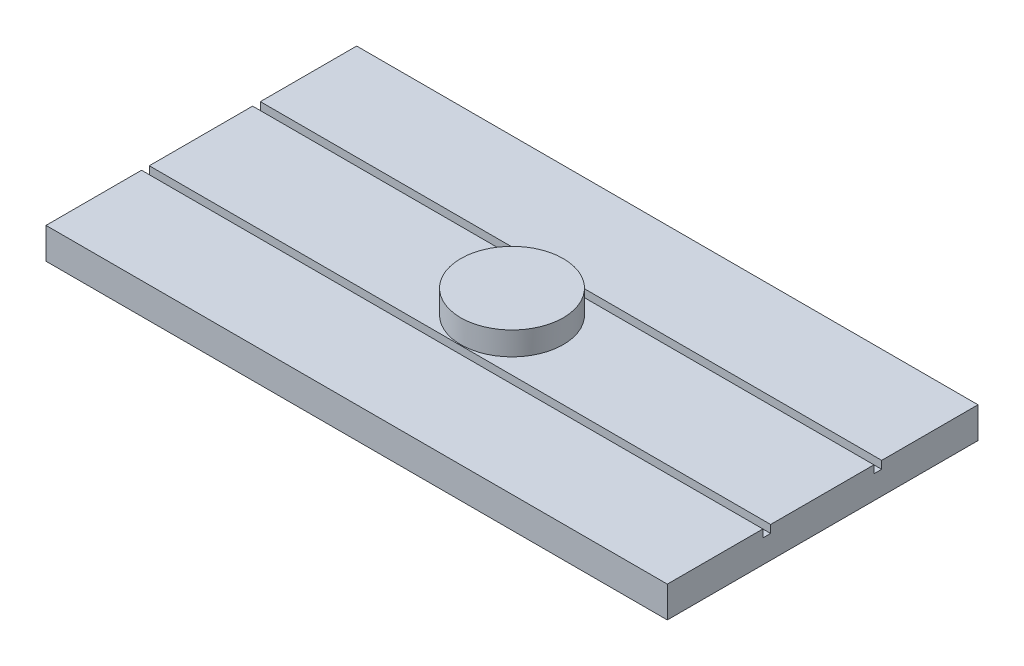
ISO-10303-21;
HEADER;
FILE_DESCRIPTION(('STEP AP214'),'2;1');
FILE_NAME('part.step','',(''),(''),'','','');
FILE_SCHEMA(('AUTOMOTIVE_DESIGN { 1 0 10303 214 1 1 1 1 }'));
ENDSEC;
DATA;
#1=APPLICATION_CONTEXT('core data for automotive mechanical design processes');
#2=APPLICATION_PROTOCOL_DEFINITION('international standard','automotive_design',2000,#1);
#3=PRODUCT_CONTEXT('',#1,'mechanical');
#4=PRODUCT('Part','Part','',(#3));
#5=PRODUCT_RELATED_PRODUCT_CATEGORY('part','',(#4));
#6=PRODUCT_DEFINITION_FORMATION('','',#4);
#7=PRODUCT_DEFINITION_CONTEXT('part definition',#1,'design');
#8=PRODUCT_DEFINITION('design','',#6,#7);
#9=PRODUCT_DEFINITION_SHAPE('','',#8);
#10=(LENGTH_UNIT() NAMED_UNIT(*) SI_UNIT(.MILLI.,.METRE.));
#11=(NAMED_UNIT(*) PLANE_ANGLE_UNIT() SI_UNIT($,.RADIAN.));
#12=(NAMED_UNIT(*) SI_UNIT($,.STERADIAN.) SOLID_ANGLE_UNIT());
#13=UNCERTAINTY_MEASURE_WITH_UNIT(LENGTH_MEASURE(1.E-05),#10,'distance_accuracy_value','');
#14=(GEOMETRIC_REPRESENTATION_CONTEXT(3) GLOBAL_UNCERTAINTY_ASSIGNED_CONTEXT((#13)) GLOBAL_UNIT_ASSIGNED_CONTEXT((#10,
#11,#12)) REPRESENTATION_CONTEXT('',''));
#15=CARTESIAN_POINT('',(0.,0.,0.));
#16=DIRECTION('',(0.,0.,1.));
#17=DIRECTION('',(1.,0.,0.));
#18=AXIS2_PLACEMENT_3D('',#15,#16,#17);
#19=CARTESIAN_POINT('',(0.,5.08,0.));
#20=DIRECTION('',(0.,-1.,0.));
#21=DIRECTION('',(0.,0.,-1.));
#22=AXIS2_PLACEMENT_3D('',#19,#20,#21);
#23=PLANE('',#22);
#24=DIRECTION('',(0.,0.,1.));
#25=VECTOR('',#24,1.);
#26=CARTESIAN_POINT('',(0.,5.08,0.));
#27=LINE('',#26,#25);
#28=CARTESIAN_POINT('',(0.,5.08,-33.782));
#29=VERTEX_POINT('',#28);
#30=CARTESIAN_POINT('',(0.,5.08,-16.891));
#31=VERTEX_POINT('',#30);
#32=EDGE_CURVE('E186',#29,#31,#27,.T.);
#33=ORIENTED_EDGE('',*,*,#32,.T.);
#34=DIRECTION('',(-1.,0.,0.));
#35=VECTOR('',#34,1.);
#36=CARTESIAN_POINT('',(0.,5.08,-16.891));
#37=LINE('',#36,#35);
#38=CARTESIAN_POINT('',(101.6,5.08,-16.891));
#39=VERTEX_POINT('',#38);
#40=EDGE_CURVE('E142',#39,#31,#37,.T.);
#41=ORIENTED_EDGE('',*,*,#40,.F.);
#42=DIRECTION('',(0.,0.,-1.));
#43=VECTOR('',#42,1.);
#44=CARTESIAN_POINT('',(101.6,5.08,0.));
#45=LINE('',#44,#43);
#46=CARTESIAN_POINT('',(101.6,5.08,-33.782));
#47=VERTEX_POINT('',#46);
#48=EDGE_CURVE('E193',#39,#47,#45,.T.);
#49=ORIENTED_EDGE('',*,*,#48,.T.);
#50=DIRECTION('',(1.,0.,0.));
#51=VECTOR('',#50,1.);
#52=CARTESIAN_POINT('',(0.,5.08,-33.782));
#53=LINE('',#52,#51);
#54=CARTESIAN_POINT('',(50.8,5.08,-33.782));
#55=VERTEX_POINT('',#54);
#56=EDGE_CURVE('E166',#55,#47,#53,.T.);
#57=ORIENTED_EDGE('',*,*,#56,.F.);
#58=CARTESIAN_POINT('',(50.8,5.08,-25.4));
#59=DIRECTION('',(0.,-1.,0.));
#60=DIRECTION('',(0.,0.,-1.));
#61=AXIS2_PLACEMENT_3D('',#58,#59,#60);
#62=CIRCLE('',#61,8.382);
#63=EDGE_CURVE('E11',#55,#55,#62,.F.);
#64=ORIENTED_EDGE('',*,*,#63,.F.);
#65=EDGE_CURVE('E157',#29,#55,#53,.T.);
#66=ORIENTED_EDGE('',*,*,#65,.F.);
#67=EDGE_LOOP('',(#33,#41,#49,#57,#64,#66));
#68=FACE_BOUND('',#67,.T.);
#69=ADVANCED_FACE('F33',(#68),#23,.F.);
#70=DIRECTION('',(1.,0.,0.));
#71=VECTOR('',#70,1.);
#72=CARTESIAN_POINT('',(0.,5.08,-35.052));
#73=LINE('',#72,#71);
#74=CARTESIAN_POINT('',(0.,5.08,-35.052));
#75=VERTEX_POINT('',#74);
#76=CARTESIAN_POINT('',(101.6,5.08,-35.052));
#77=VERTEX_POINT('',#76);
#78=EDGE_CURVE('E163',#75,#77,#73,.T.);
#79=ORIENTED_EDGE('',*,*,#78,.T.);
#80=CARTESIAN_POINT('',(101.6,5.08,-50.8));
#81=VERTEX_POINT('',#80);
#82=EDGE_CURVE('E188',#77,#81,#45,.T.);
#83=ORIENTED_EDGE('',*,*,#82,.T.);
#84=DIRECTION('',(-1.,0.,0.));
#85=VECTOR('',#84,1.);
#86=CARTESIAN_POINT('',(0.,5.08,-50.8));
#87=LINE('',#86,#85);
#88=CARTESIAN_POINT('',(0.,5.08,-50.8));
#89=VERTEX_POINT('',#88);
#90=EDGE_CURVE('E192',#81,#89,#87,.T.);
#91=ORIENTED_EDGE('',*,*,#90,.T.);
#92=EDGE_CURVE('E182',#89,#75,#27,.T.);
#93=ORIENTED_EDGE('',*,*,#92,.T.);
#94=EDGE_LOOP('',(#79,#83,#91,#93));
#95=FACE_BOUND('',#94,.T.);
#96=ADVANCED_FACE('F232',(#95),#23,.F.);
#97=CARTESIAN_POINT('',(0.,5.08,0.));
#98=DIRECTION('',(1.,0.,0.));
#99=DIRECTION('',(0.,0.,-1.));
#100=AXIS2_PLACEMENT_3D('',#97,#98,#99);
#101=PLANE('',#100);
#102=DIRECTION('',(0.,0.,1.));
#103=VECTOR('',#102,1.);
#104=CARTESIAN_POINT('',(0.,3.81,-16.891));
#105=LINE('',#104,#103);
#106=CARTESIAN_POINT('',(0.,3.81,-16.891));
#107=VERTEX_POINT('',#106);
#108=CARTESIAN_POINT('',(0.,3.81,-15.621));
#109=VERTEX_POINT('',#108);
#110=EDGE_CURVE('E133',#107,#109,#105,.T.);
#111=ORIENTED_EDGE('',*,*,#110,.F.);
#112=DIRECTION('',(0.,1.,0.));
#113=VECTOR('',#112,1.);
#114=CARTESIAN_POINT('',(0.,3.81,-16.891));
#115=LINE('',#114,#113);
#116=EDGE_CURVE('E167',#107,#31,#115,.T.);
#117=ORIENTED_EDGE('',*,*,#116,.T.);
#118=ORIENTED_EDGE('',*,*,#32,.F.);
#119=DIRECTION('',(0.,1.,0.));
#120=VECTOR('',#119,1.);
#121=CARTESIAN_POINT('',(0.,3.81,-33.782));
#122=LINE('',#121,#120);
#123=CARTESIAN_POINT('',(0.,3.81,-33.782));
#124=VERTEX_POINT('',#123);
#125=EDGE_CURVE('E162',#124,#29,#122,.T.);
#126=ORIENTED_EDGE('',*,*,#125,.F.);
#127=DIRECTION('',(0.,0.,-1.));
#128=VECTOR('',#127,1.);
#129=CARTESIAN_POINT('',(0.,3.81,-33.782));
#130=LINE('',#129,#128);
#131=CARTESIAN_POINT('',(0.,3.81,-35.052));
#132=VERTEX_POINT('',#131);
#133=EDGE_CURVE('E153',#124,#132,#130,.T.);
#134=ORIENTED_EDGE('',*,*,#133,.T.);
#135=DIRECTION('',(0.,1.,0.));
#136=VECTOR('',#135,1.);
#137=CARTESIAN_POINT('',(0.,3.81,-35.052));
#138=LINE('',#137,#136);
#139=EDGE_CURVE('E175',#132,#75,#138,.T.);
#140=ORIENTED_EDGE('',*,*,#139,.T.);
#141=ORIENTED_EDGE('',*,*,#92,.F.);
#142=DIRECTION('',(0.,-1.,0.));
#143=VECTOR('',#142,1.);
#144=CARTESIAN_POINT('',(0.,5.08,-50.8));
#145=LINE('',#144,#143);
#146=CARTESIAN_POINT('',(0.,0.,-50.8));
#147=VERTEX_POINT('',#146);
#148=EDGE_CURVE('E195',#89,#147,#145,.T.);
#149=ORIENTED_EDGE('',*,*,#148,.T.);
#150=DIRECTION('',(0.,0.,1.));
#151=VECTOR('',#150,1.);
#152=CARTESIAN_POINT('',(0.,0.,0.));
#153=LINE('',#152,#151);
#154=CARTESIAN_POINT('',(0.,0.,0.));
#155=VERTEX_POINT('',#154);
#156=EDGE_CURVE('E180',#147,#155,#153,.T.);
#157=ORIENTED_EDGE('',*,*,#156,.T.);
#158=DIRECTION('',(0.,-1.,0.));
#159=VECTOR('',#158,1.);
#160=CARTESIAN_POINT('',(0.,5.08,0.));
#161=LINE('',#160,#159);
#162=CARTESIAN_POINT('',(0.,5.08,0.));
#163=VERTEX_POINT('',#162);
#164=EDGE_CURVE('E37',#163,#155,#161,.T.);
#165=ORIENTED_EDGE('',*,*,#164,.F.);
#166=CARTESIAN_POINT('',(0.,5.08,-15.621));
#167=VERTEX_POINT('',#166);
#168=EDGE_CURVE('E146',#167,#163,#27,.T.);
#169=ORIENTED_EDGE('',*,*,#168,.F.);
#170=DIRECTION('',(0.,1.,0.));
#171=VECTOR('',#170,1.);
#172=CARTESIAN_POINT('',(0.,3.81,-15.621));
#173=LINE('',#172,#171);
#174=EDGE_CURVE('E49',#109,#167,#173,.T.);
#175=ORIENTED_EDGE('',*,*,#174,.F.);
#176=EDGE_LOOP('',(#111,#117,#118,#126,#134,#140,#141,#149,#157,#165,#169,#175));
#177=FACE_BOUND('',#176,.T.);
#178=ADVANCED_FACE('F35',(#177),#101,.F.);
#179=CARTESIAN_POINT('',(101.6,5.08,0.));
#180=DIRECTION('',(-1.,0.,0.));
#181=DIRECTION('',(0.,0.,1.));
#182=AXIS2_PLACEMENT_3D('',#179,#180,#181);
#183=PLANE('',#182);
#184=ORIENTED_EDGE('',*,*,#48,.F.);
#185=DIRECTION('',(0.,1.,0.));
#186=VECTOR('',#185,1.);
#187=CARTESIAN_POINT('',(101.6,3.81,-16.891));
#188=LINE('',#187,#186);
#189=CARTESIAN_POINT('',(101.6,3.81,-16.891));
#190=VERTEX_POINT('',#189);
#191=EDGE_CURVE('E148',#190,#39,#188,.T.);
#192=ORIENTED_EDGE('',*,*,#191,.F.);
#193=DIRECTION('',(0.,0.,-1.));
#194=VECTOR('',#193,1.);
#195=CARTESIAN_POINT('',(101.6,3.81,-16.891));
#196=LINE('',#195,#194);
#197=CARTESIAN_POINT('',(101.6,3.81,-15.621));
#198=VERTEX_POINT('',#197);
#199=EDGE_CURVE('E132',#198,#190,#196,.T.);
#200=ORIENTED_EDGE('',*,*,#199,.F.);
#201=DIRECTION('',(0.,1.,0.));
#202=VECTOR('',#201,1.);
#203=CARTESIAN_POINT('',(101.6,3.81,-15.621));
#204=LINE('',#203,#202);
#205=CARTESIAN_POINT('',(101.6,5.08,-15.621));
#206=VERTEX_POINT('',#205);
#207=EDGE_CURVE('E129',#198,#206,#204,.T.);
#208=ORIENTED_EDGE('',*,*,#207,.T.);
#209=CARTESIAN_POINT('',(101.6,5.08,0.));
#210=VERTEX_POINT('',#209);
#211=EDGE_CURVE('E189',#210,#206,#45,.T.);
#212=ORIENTED_EDGE('',*,*,#211,.F.);
#213=DIRECTION('',(0.,-1.,0.));
#214=VECTOR('',#213,1.);
#215=CARTESIAN_POINT('',(101.6,5.08,0.));
#216=LINE('',#215,#214);
#217=CARTESIAN_POINT('',(101.6,0.,0.));
#218=VERTEX_POINT('',#217);
#219=EDGE_CURVE('E208',#210,#218,#216,.T.);
#220=ORIENTED_EDGE('',*,*,#219,.T.);
#221=DIRECTION('',(0.,0.,-1.));
#222=VECTOR('',#221,1.);
#223=CARTESIAN_POINT('',(101.6,0.,0.));
#224=LINE('',#223,#222);
#225=CARTESIAN_POINT('',(101.6,0.,-50.8));
#226=VERTEX_POINT('',#225);
#227=EDGE_CURVE('E200',#218,#226,#224,.T.);
#228=ORIENTED_EDGE('',*,*,#227,.T.);
#229=DIRECTION('',(0.,-1.,0.));
#230=VECTOR('',#229,1.);
#231=CARTESIAN_POINT('',(101.6,5.08,-50.8));
#232=LINE('',#231,#230);
#233=EDGE_CURVE('E206',#81,#226,#232,.T.);
#234=ORIENTED_EDGE('',*,*,#233,.F.);
#235=ORIENTED_EDGE('',*,*,#82,.F.);
#236=DIRECTION('',(0.,1.,0.));
#237=VECTOR('',#236,1.);
#238=CARTESIAN_POINT('',(101.6,3.81,-35.052));
#239=LINE('',#238,#237);
#240=CARTESIAN_POINT('',(101.6,3.81,-35.052));
#241=VERTEX_POINT('',#240);
#242=EDGE_CURVE('E173',#241,#77,#239,.T.);
#243=ORIENTED_EDGE('',*,*,#242,.F.);
#244=DIRECTION('',(0.,0.,-1.));
#245=VECTOR('',#244,1.);
#246=CARTESIAN_POINT('',(101.6,3.81,-33.782));
#247=LINE('',#246,#245);
#248=CARTESIAN_POINT('',(101.6,3.81,-33.782));
#249=VERTEX_POINT('',#248);
#250=EDGE_CURVE('E159',#249,#241,#247,.T.);
#251=ORIENTED_EDGE('',*,*,#250,.F.);
#252=DIRECTION('',(0.,1.,0.));
#253=VECTOR('',#252,1.);
#254=CARTESIAN_POINT('',(101.6,3.81,-33.782));
#255=LINE('',#254,#253);
#256=EDGE_CURVE('E170',#249,#47,#255,.T.);
#257=ORIENTED_EDGE('',*,*,#256,.T.);
#258=EDGE_LOOP('',(#184,#192,#200,#208,#212,#220,#228,#234,#235,#243,#251,#257));
#259=FACE_BOUND('',#258,.T.);
#260=ADVANCED_FACE('F226',(#259),#183,.F.);
#261=ORIENTED_EDGE('',*,*,#211,.T.);
#262=DIRECTION('',(1.,0.,0.));
#263=VECTOR('',#262,1.);
#264=CARTESIAN_POINT('',(0.,5.08,-15.621));
#265=LINE('',#264,#263);
#266=EDGE_CURVE('E278',#167,#206,#265,.T.);
#267=ORIENTED_EDGE('',*,*,#266,.F.);
#268=ORIENTED_EDGE('',*,*,#168,.T.);
#269=DIRECTION('',(1.,0.,0.));
#270=VECTOR('',#269,1.);
#271=CARTESIAN_POINT('',(0.,5.08,0.));
#272=LINE('',#271,#270);
#273=EDGE_CURVE('E185',#163,#210,#272,.T.);
#274=ORIENTED_EDGE('',*,*,#273,.T.);
#275=EDGE_LOOP('',(#261,#267,#268,#274));
#276=FACE_BOUND('',#275,.T.);
#277=ADVANCED_FACE('F267',(#276),#23,.F.);
#278=CARTESIAN_POINT('',(0.,5.08,0.));
#279=DIRECTION('',(0.,0.,-1.));
#280=DIRECTION('',(-1.,0.,0.));
#281=AXIS2_PLACEMENT_3D('',#278,#279,#280);
#282=PLANE('',#281);
#283=DIRECTION('',(1.,0.,0.));
#284=VECTOR('',#283,1.);
#285=CARTESIAN_POINT('',(0.,0.,0.));
#286=LINE('',#285,#284);
#287=EDGE_CURVE('E198',#155,#218,#286,.T.);
#288=ORIENTED_EDGE('',*,*,#287,.T.);
#289=ORIENTED_EDGE('',*,*,#219,.F.);
#290=ORIENTED_EDGE('',*,*,#273,.F.);
#291=ORIENTED_EDGE('',*,*,#164,.T.);
#292=EDGE_LOOP('',(#288,#289,#290,#291));
#293=FACE_BOUND('',#292,.T.);
#294=ADVANCED_FACE('F217',(#293),#282,.F.);
#295=CARTESIAN_POINT('',(0.,5.08,-50.8));
#296=DIRECTION('',(0.,0.,1.));
#297=DIRECTION('',(1.,0.,0.));
#298=AXIS2_PLACEMENT_3D('',#295,#296,#297);
#299=PLANE('',#298);
#300=DIRECTION('',(-1.,0.,0.));
#301=VECTOR('',#300,1.);
#302=CARTESIAN_POINT('',(0.,0.,-50.8));
#303=LINE('',#302,#301);
#304=EDGE_CURVE('E202',#226,#147,#303,.T.);
#305=ORIENTED_EDGE('',*,*,#304,.T.);
#306=ORIENTED_EDGE('',*,*,#148,.F.);
#307=ORIENTED_EDGE('',*,*,#90,.F.);
#308=ORIENTED_EDGE('',*,*,#233,.T.);
#309=EDGE_LOOP('',(#305,#306,#307,#308));
#310=FACE_BOUND('',#309,.T.);
#311=ADVANCED_FACE('F230',(#310),#299,.F.);
#312=CARTESIAN_POINT('',(0.,0.,0.));
#313=DIRECTION('',(0.,-1.,0.));
#314=DIRECTION('',(0.,0.,-1.));
#315=AXIS2_PLACEMENT_3D('',#312,#313,#314);
#316=PLANE('',#315);
#317=ORIENTED_EDGE('',*,*,#156,.F.);
#318=ORIENTED_EDGE('',*,*,#304,.F.);
#319=ORIENTED_EDGE('',*,*,#227,.F.);
#320=ORIENTED_EDGE('',*,*,#287,.F.);
#321=EDGE_LOOP('',(#317,#318,#319,#320));
#322=FACE_BOUND('',#321,.T.);
#323=ADVANCED_FACE('F223',(#322),#316,.T.);
#324=CARTESIAN_POINT('',(50.8,8.89,-25.4));
#325=DIRECTION('',(0.,-1.,0.));
#326=DIRECTION('',(0.,0.,-1.));
#327=AXIS2_PLACEMENT_3D('',#324,#325,#326);
#328=CYLINDRICAL_SURFACE('',#327,8.382);
#329=CARTESIAN_POINT('',(50.8,8.89,-25.4));
#330=DIRECTION('',(0.,1.,0.));
#331=DIRECTION('',(0.,0.,1.));
#332=AXIS2_PLACEMENT_3D('',#329,#330,#331);
#333=CIRCLE('',#332,8.382);
#334=CARTESIAN_POINT('',(50.8,8.89,-17.018));
#335=VERTEX_POINT('',#334);
#336=EDGE_CURVE('E178',#335,#335,#333,.T.);
#337=ORIENTED_EDGE('',*,*,#336,.F.);
#338=EDGE_LOOP('',(#337));
#339=FACE_BOUND('',#338,.T.);
#340=ORIENTED_EDGE('',*,*,#63,.T.);
#341=EDGE_LOOP('',(#340));
#342=FACE_BOUND('',#341,.T.);
#343=ADVANCED_FACE('F252',(#339,#342),#328,.T.);
#344=CARTESIAN_POINT('',(50.8,8.89,-25.4));
#345=DIRECTION('',(0.,1.,0.));
#346=DIRECTION('',(0.,0.,1.));
#347=AXIS2_PLACEMENT_3D('',#344,#345,#346);
#348=PLANE('',#347);
#349=ORIENTED_EDGE('',*,*,#336,.T.);
#350=EDGE_LOOP('',(#349));
#351=FACE_BOUND('',#350,.T.);
#352=ADVANCED_FACE('F254',(#351),#348,.T.);
#353=CARTESIAN_POINT('',(0.,3.81,-35.052));
#354=DIRECTION('',(0.,0.,1.));
#355=DIRECTION('',(1.,0.,0.));
#356=AXIS2_PLACEMENT_3D('',#353,#354,#355);
#357=PLANE('',#356);
#358=ORIENTED_EDGE('',*,*,#78,.F.);
#359=ORIENTED_EDGE('',*,*,#139,.F.);
#360=DIRECTION('',(1.,0.,0.));
#361=VECTOR('',#360,1.);
#362=CARTESIAN_POINT('',(0.,3.81,-35.052));
#363=LINE('',#362,#361);
#364=EDGE_CURVE('E156',#132,#241,#363,.T.);
#365=ORIENTED_EDGE('',*,*,#364,.T.);
#366=ORIENTED_EDGE('',*,*,#242,.T.);
#367=EDGE_LOOP('',(#358,#359,#365,#366));
#368=FACE_BOUND('',#367,.T.);
#369=ADVANCED_FACE('F248',(#368),#357,.T.);
#370=CARTESIAN_POINT('',(0.,3.81,-33.782));
#371=DIRECTION('',(0.,0.,1.));
#372=DIRECTION('',(1.,0.,0.));
#373=AXIS2_PLACEMENT_3D('',#370,#371,#372);
#374=PLANE('',#373);
#375=ORIENTED_EDGE('',*,*,#65,.T.);
#376=ORIENTED_EDGE('',*,*,#56,.T.);
#377=ORIENTED_EDGE('',*,*,#256,.F.);
#378=DIRECTION('',(1.,0.,0.));
#379=VECTOR('',#378,1.);
#380=CARTESIAN_POINT('',(0.,3.81,-33.782));
#381=LINE('',#380,#379);
#382=EDGE_CURVE('E57',#124,#249,#381,.T.);
#383=ORIENTED_EDGE('',*,*,#382,.F.);
#384=ORIENTED_EDGE('',*,*,#125,.T.);
#385=EDGE_LOOP('',(#375,#376,#377,#383,#384));
#386=FACE_BOUND('',#385,.T.);
#387=ADVANCED_FACE('F242',(#386),#374,.F.);
#388=CARTESIAN_POINT('',(0.,3.81,0.));
#389=DIRECTION('',(0.,-1.,0.));
#390=DIRECTION('',(0.,0.,-1.));
#391=AXIS2_PLACEMENT_3D('',#388,#389,#390);
#392=PLANE('',#391);
#393=ORIENTED_EDGE('',*,*,#133,.F.);
#394=ORIENTED_EDGE('',*,*,#382,.T.);
#395=ORIENTED_EDGE('',*,*,#250,.T.);
#396=ORIENTED_EDGE('',*,*,#364,.F.);
#397=EDGE_LOOP('',(#393,#394,#395,#396));
#398=FACE_BOUND('',#397,.T.);
#399=ADVANCED_FACE('F245',(#398),#392,.F.);
#400=CARTESIAN_POINT('',(0.,3.81,-16.891));
#401=DIRECTION('',(0.,0.,-1.));
#402=DIRECTION('',(-1.,0.,0.));
#403=AXIS2_PLACEMENT_3D('',#400,#401,#402);
#404=PLANE('',#403);
#405=ORIENTED_EDGE('',*,*,#40,.T.);
#406=ORIENTED_EDGE('',*,*,#116,.F.);
#407=DIRECTION('',(-1.,0.,0.));
#408=VECTOR('',#407,1.);
#409=CARTESIAN_POINT('',(0.,3.81,-16.891));
#410=LINE('',#409,#408);
#411=EDGE_CURVE('E139',#190,#107,#410,.T.);
#412=ORIENTED_EDGE('',*,*,#411,.F.);
#413=ORIENTED_EDGE('',*,*,#191,.T.);
#414=EDGE_LOOP('',(#405,#406,#412,#413));
#415=FACE_BOUND('',#414,.T.);
#416=ADVANCED_FACE('F284',(#415),#404,.F.);
#417=CARTESIAN_POINT('',(0.,3.81,-15.621));
#418=DIRECTION('',(0.,0.,1.));
#419=DIRECTION('',(1.,0.,0.));
#420=AXIS2_PLACEMENT_3D('',#417,#418,#419);
#421=PLANE('',#420);
#422=ORIENTED_EDGE('',*,*,#266,.T.);
#423=ORIENTED_EDGE('',*,*,#207,.F.);
#424=DIRECTION('',(1.,0.,0.));
#425=VECTOR('',#424,1.);
#426=CARTESIAN_POINT('',(0.,3.81,-15.621));
#427=LINE('',#426,#425);
#428=EDGE_CURVE('E125',#109,#198,#427,.T.);
#429=ORIENTED_EDGE('',*,*,#428,.F.);
#430=ORIENTED_EDGE('',*,*,#174,.T.);
#431=EDGE_LOOP('',(#422,#423,#429,#430));
#432=FACE_BOUND('',#431,.T.);
#433=ADVANCED_FACE('F127',(#432),#421,.F.);
#434=CARTESIAN_POINT('',(0.,3.81,0.));
#435=DIRECTION('',(0.,1.,0.));
#436=DIRECTION('',(0.,0.,1.));
#437=AXIS2_PLACEMENT_3D('',#434,#435,#436);
#438=PLANE('',#437);
#439=ORIENTED_EDGE('',*,*,#110,.T.);
#440=ORIENTED_EDGE('',*,*,#428,.T.);
#441=ORIENTED_EDGE('',*,*,#199,.T.);
#442=ORIENTED_EDGE('',*,*,#411,.T.);
#443=EDGE_LOOP('',(#439,#440,#441,#442));
#444=FACE_BOUND('',#443,.T.);
#445=ADVANCED_FACE('F137',(#444),#438,.T.);
#446=CLOSED_SHELL('',(#69,#96,#178,#260,#277,#294,#311,#323,#343,#352,#369,#387,#399,#416,#433,#445));
#447=MANIFOLD_SOLID_BREP('B2',#446);
#448=ADVANCED_BREP_SHAPE_REPRESENTATION('',(#18,#447),#14);
#449=SHAPE_DEFINITION_REPRESENTATION(#9,#448);
ENDSEC;
END-ISO-10303-21;
